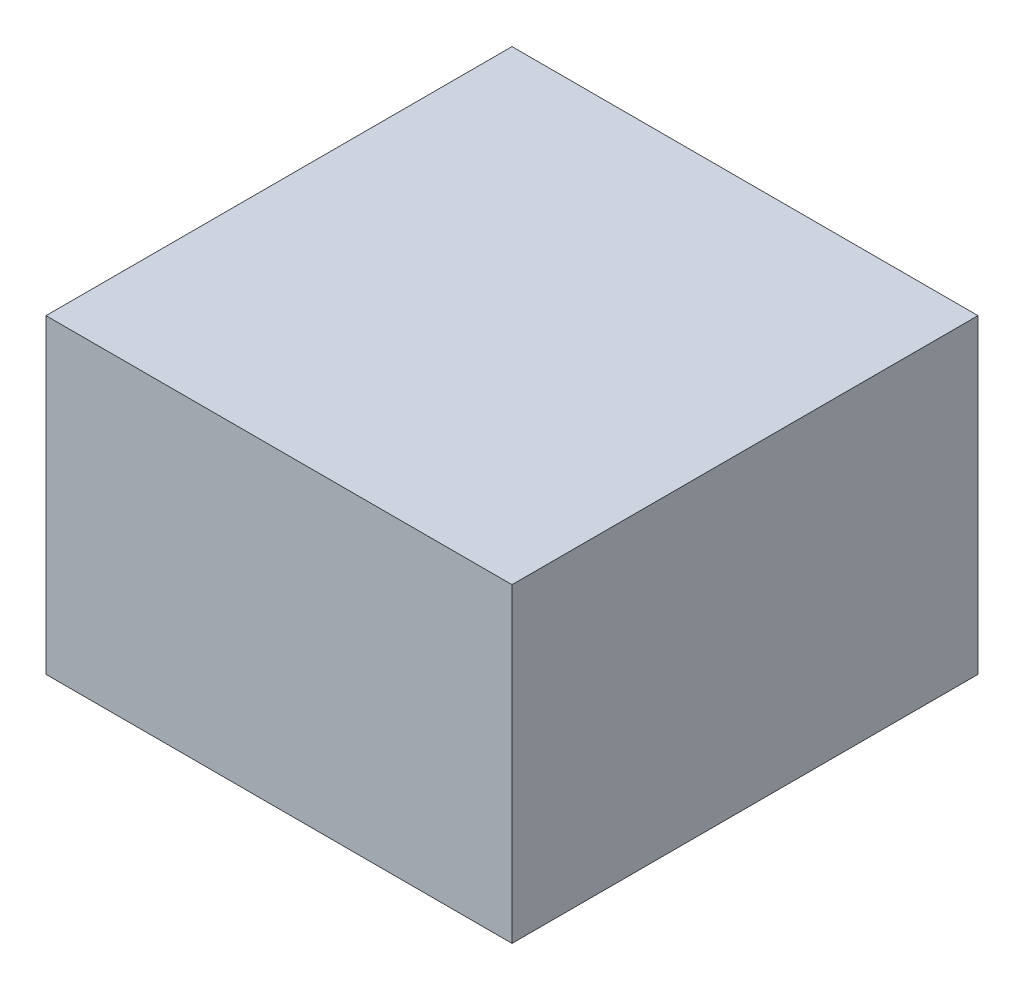
ISO-10303-21;
HEADER;
FILE_DESCRIPTION(('STEP AP214'),'2;1');
FILE_NAME('part.step','',(''),(''),'','','');
FILE_SCHEMA(('AUTOMOTIVE_DESIGN { 1 0 10303 214 1 1 1 1 }'));
ENDSEC;
DATA;
#1=APPLICATION_CONTEXT('core data for automotive mechanical design processes');
#2=APPLICATION_PROTOCOL_DEFINITION('international standard','automotive_design',2000,#1);
#3=PRODUCT_CONTEXT('',#1,'mechanical');
#4=PRODUCT('Part','Part','',(#3));
#5=PRODUCT_RELATED_PRODUCT_CATEGORY('part','',(#4));
#6=PRODUCT_DEFINITION_FORMATION('','',#4);
#7=PRODUCT_DEFINITION_CONTEXT('part definition',#1,'design');
#8=PRODUCT_DEFINITION('design','',#6,#7);
#9=PRODUCT_DEFINITION_SHAPE('','',#8);
#10=(LENGTH_UNIT() NAMED_UNIT(*) SI_UNIT(.MILLI.,.METRE.));
#11=(NAMED_UNIT(*) PLANE_ANGLE_UNIT() SI_UNIT($,.RADIAN.));
#12=(NAMED_UNIT(*) SI_UNIT($,.STERADIAN.) SOLID_ANGLE_UNIT());
#13=UNCERTAINTY_MEASURE_WITH_UNIT(LENGTH_MEASURE(1.E-05),#10,'distance_accuracy_value','');
#14=(GEOMETRIC_REPRESENTATION_CONTEXT(3) GLOBAL_UNCERTAINTY_ASSIGNED_CONTEXT((#13)) GLOBAL_UNIT_ASSIGNED_CONTEXT((#10,
#11,#12)) REPRESENTATION_CONTEXT('',''));
#15=CARTESIAN_POINT('',(0.,0.,0.));
#16=DIRECTION('',(0.,0.,1.));
#17=DIRECTION('',(1.,0.,0.));
#18=AXIS2_PLACEMENT_3D('',#15,#16,#17);
#19=CARTESIAN_POINT('',(30.,-20.,60.));
#20=DIRECTION('',(-1.,0.,0.));
#21=DIRECTION('',(0.,0.,1.));
#22=AXIS2_PLACEMENT_3D('',#19,#20,#21);
#23=PLANE('',#22);
#24=DIRECTION('',(0.,1.,0.));
#25=VECTOR('',#24,1.);
#26=CARTESIAN_POINT('',(30.,-20.,0.));
#27=LINE('',#26,#25);
#28=CARTESIAN_POINT('',(30.,-20.,0.));
#29=VERTEX_POINT('',#28);
#30=CARTESIAN_POINT('',(30.,20.,0.));
#31=VERTEX_POINT('',#30);
#32=EDGE_CURVE('E145',#29,#31,#27,.T.);
#33=ORIENTED_EDGE('',*,*,#32,.T.);
#34=DIRECTION('',(0.,0.,-1.));
#35=VECTOR('',#34,1.);
#36=CARTESIAN_POINT('',(30.,20.,60.));
#37=LINE('',#36,#35);
#38=CARTESIAN_POINT('',(30.,20.,60.));
#39=VERTEX_POINT('',#38);
#40=EDGE_CURVE('E11',#39,#31,#37,.T.);
#41=ORIENTED_EDGE('',*,*,#40,.F.);
#42=DIRECTION('',(0.,1.,0.));
#43=VECTOR('',#42,1.);
#44=CARTESIAN_POINT('',(30.,-20.,60.));
#45=LINE('',#44,#43);
#46=CARTESIAN_POINT('',(30.,-20.,60.));
#47=VERTEX_POINT('',#46);
#48=EDGE_CURVE('E149',#47,#39,#45,.T.);
#49=ORIENTED_EDGE('',*,*,#48,.F.);
#50=DIRECTION('',(0.,0.,-1.));
#51=VECTOR('',#50,1.);
#52=CARTESIAN_POINT('',(30.,-20.,60.));
#53=LINE('',#52,#51);
#54=EDGE_CURVE('E155',#47,#29,#53,.T.);
#55=ORIENTED_EDGE('',*,*,#54,.T.);
#56=EDGE_LOOP('',(#33,#41,#49,#55));
#57=FACE_BOUND('',#56,.T.);
#58=ADVANCED_FACE('F33',(#57),#23,.F.);
#59=CARTESIAN_POINT('',(-30.,20.,60.));
#60=DIRECTION('',(0.,-1.,0.));
#61=DIRECTION('',(0.,0.,-1.));
#62=AXIS2_PLACEMENT_3D('',#59,#60,#61);
#63=PLANE('',#62);
#64=DIRECTION('',(-1.,0.,0.));
#65=VECTOR('',#64,1.);
#66=CARTESIAN_POINT('',(-30.,20.,0.));
#67=LINE('',#66,#65);
#68=CARTESIAN_POINT('',(-30.,20.,0.));
#69=VERTEX_POINT('',#68);
#70=EDGE_CURVE('E158',#31,#69,#67,.T.);
#71=ORIENTED_EDGE('',*,*,#70,.T.);
#72=DIRECTION('',(0.,0.,-1.));
#73=VECTOR('',#72,1.);
#74=CARTESIAN_POINT('',(-30.,20.,60.));
#75=LINE('',#74,#73);
#76=CARTESIAN_POINT('',(-30.,20.,60.));
#77=VERTEX_POINT('',#76);
#78=EDGE_CURVE('E40',#77,#69,#75,.T.);
#79=ORIENTED_EDGE('',*,*,#78,.F.);
#80=DIRECTION('',(-1.,0.,0.));
#81=VECTOR('',#80,1.);
#82=CARTESIAN_POINT('',(-30.,20.,60.));
#83=LINE('',#82,#81);
#84=EDGE_CURVE('E84',#39,#77,#83,.T.);
#85=ORIENTED_EDGE('',*,*,#84,.F.);
#86=ORIENTED_EDGE('',*,*,#40,.T.);
#87=EDGE_LOOP('',(#71,#79,#85,#86));
#88=FACE_BOUND('',#87,.T.);
#89=ADVANCED_FACE('F186',(#88),#63,.F.);
#90=CARTESIAN_POINT('',(-30.,-20.,60.));
#91=DIRECTION('',(1.,0.,0.));
#92=DIRECTION('',(0.,0.,-1.));
#93=AXIS2_PLACEMENT_3D('',#90,#91,#92);
#94=PLANE('',#93);
#95=DIRECTION('',(0.,-1.,0.));
#96=VECTOR('',#95,1.);
#97=CARTESIAN_POINT('',(-30.,-20.,0.));
#98=LINE('',#97,#96);
#99=CARTESIAN_POINT('',(-30.,-20.,0.));
#100=VERTEX_POINT('',#99);
#101=EDGE_CURVE('E160',#69,#100,#98,.T.);
#102=ORIENTED_EDGE('',*,*,#101,.T.);
#103=DIRECTION('',(0.,0.,-1.));
#104=VECTOR('',#103,1.);
#105=CARTESIAN_POINT('',(-30.,-20.,60.));
#106=LINE('',#105,#104);
#107=CARTESIAN_POINT('',(-30.,-20.,60.));
#108=VERTEX_POINT('',#107);
#109=EDGE_CURVE('E164',#108,#100,#106,.T.);
#110=ORIENTED_EDGE('',*,*,#109,.F.);
#111=DIRECTION('',(0.,-1.,0.));
#112=VECTOR('',#111,1.);
#113=CARTESIAN_POINT('',(-30.,-20.,60.));
#114=LINE('',#113,#112);
#115=EDGE_CURVE('E152',#77,#108,#114,.T.);
#116=ORIENTED_EDGE('',*,*,#115,.F.);
#117=ORIENTED_EDGE('',*,*,#78,.T.);
#118=EDGE_LOOP('',(#102,#110,#116,#117));
#119=FACE_BOUND('',#118,.T.);
#120=ADVANCED_FACE('F169',(#119),#94,.F.);
#121=CARTESIAN_POINT('',(-30.,-20.,60.));
#122=DIRECTION('',(0.,1.,0.));
#123=DIRECTION('',(0.,0.,1.));
#124=AXIS2_PLACEMENT_3D('',#121,#122,#123);
#125=PLANE('',#124);
#126=DIRECTION('',(1.,0.,0.));
#127=VECTOR('',#126,1.);
#128=CARTESIAN_POINT('',(-30.,-20.,0.));
#129=LINE('',#128,#127);
#130=EDGE_CURVE('E77',#100,#29,#129,.T.);
#131=ORIENTED_EDGE('',*,*,#130,.T.);
#132=ORIENTED_EDGE('',*,*,#54,.F.);
#133=DIRECTION('',(1.,0.,0.));
#134=VECTOR('',#133,1.);
#135=CARTESIAN_POINT('',(-30.,-20.,60.));
#136=LINE('',#135,#134);
#137=EDGE_CURVE('E56',#108,#47,#136,.T.);
#138=ORIENTED_EDGE('',*,*,#137,.F.);
#139=ORIENTED_EDGE('',*,*,#109,.T.);
#140=EDGE_LOOP('',(#131,#132,#138,#139));
#141=FACE_BOUND('',#140,.T.);
#142=ADVANCED_FACE('F177',(#141),#125,.F.);
#143=CARTESIAN_POINT('',(0.,0.,60.));
#144=DIRECTION('',(0.,0.,-1.));
#145=DIRECTION('',(-1.,0.,0.));
#146=AXIS2_PLACEMENT_3D('',#143,#144,#145);
#147=PLANE('',#146);
#148=ORIENTED_EDGE('',*,*,#48,.T.);
#149=ORIENTED_EDGE('',*,*,#84,.T.);
#150=ORIENTED_EDGE('',*,*,#115,.T.);
#151=ORIENTED_EDGE('',*,*,#137,.T.);
#152=EDGE_LOOP('',(#148,#149,#150,#151));
#153=FACE_BOUND('',#152,.T.);
#154=ADVANCED_FACE('F179',(#153),#147,.F.);
#155=CARTESIAN_POINT('',(0.,0.,0.));
#156=DIRECTION('',(0.,0.,-1.));
#157=DIRECTION('',(-1.,0.,0.));
#158=AXIS2_PLACEMENT_3D('',#155,#156,#157);
#159=PLANE('',#158);
#160=CARTESIAN_POINT('',(26.,17.3333333333333,0.));
#161=DIRECTION('',(0.,0.,-1.));
#162=DIRECTION('',(1.,0.,0.));
#163=AXIS2_PLACEMENT_3D('',#160,#161,#162);
#164=CIRCLE('',#163,2.);
#165=CARTESIAN_POINT('',(28.,17.3333333333333,0.));
#166=VERTEX_POINT('',#165);
#167=EDGE_CURVE('E346',#166,#166,#164,.T.);
#168=ORIENTED_EDGE('',*,*,#167,.F.);
#169=EDGE_LOOP('',(#168));
#170=FACE_BOUND('',#169,.T.);
#171=CARTESIAN_POINT('',(-26.,-17.3333333333333,0.));
#172=DIRECTION('',(0.,0.,-1.));
#173=DIRECTION('',(1.,0.,0.));
#174=AXIS2_PLACEMENT_3D('',#171,#172,#173);
#175=CIRCLE('',#174,2.);
#176=CARTESIAN_POINT('',(-24.,-17.3333333333333,0.));
#177=VERTEX_POINT('',#176);
#178=EDGE_CURVE('E358',#177,#177,#175,.T.);
#179=ORIENTED_EDGE('',*,*,#178,.F.);
#180=EDGE_LOOP('',(#179));
#181=FACE_BOUND('',#180,.T.);
#182=CARTESIAN_POINT('',(26.,-17.3333333333333,0.));
#183=DIRECTION('',(0.,0.,-1.));
#184=DIRECTION('',(-1.,0.,0.));
#185=AXIS2_PLACEMENT_3D('',#182,#183,#184);
#186=CIRCLE('',#185,2.);
#187=CARTESIAN_POINT('',(24.,-17.3333333333333,0.));
#188=VERTEX_POINT('',#187);
#189=EDGE_CURVE('E353',#188,#188,#186,.T.);
#190=ORIENTED_EDGE('',*,*,#189,.F.);
#191=EDGE_LOOP('',(#190));
#192=FACE_BOUND('',#191,.T.);
#193=CARTESIAN_POINT('',(-26.,17.3333333333333,0.));
#194=DIRECTION('',(0.,0.,-1.));
#195=DIRECTION('',(-1.,0.,0.));
#196=AXIS2_PLACEMENT_3D('',#193,#194,#195);
#197=CIRCLE('',#196,2.);
#198=CARTESIAN_POINT('',(-28.,17.3333333333333,0.));
#199=VERTEX_POINT('',#198);
#200=EDGE_CURVE('E132',#199,#199,#197,.T.);
#201=ORIENTED_EDGE('',*,*,#200,.F.);
#202=EDGE_LOOP('',(#201));
#203=FACE_BOUND('',#202,.T.);
#204=DIRECTION('',(0.,1.,0.));
#205=VECTOR('',#204,1.);
#206=CARTESIAN_POINT('',(-20.25,-10.,0.));
#207=LINE('',#206,#205);
#208=CARTESIAN_POINT('',(-20.25,-10.,0.));
#209=VERTEX_POINT('',#208);
#210=CARTESIAN_POINT('',(-20.25,10.,0.));
#211=VERTEX_POINT('',#210);
#212=EDGE_CURVE('E47',#209,#211,#207,.T.);
#213=ORIENTED_EDGE('',*,*,#212,.F.);
#214=DIRECTION('',(-1.,0.,0.));
#215=VECTOR('',#214,1.);
#216=CARTESIAN_POINT('',(20.25,-10.,0.));
#217=LINE('',#216,#215);
#218=CARTESIAN_POINT('',(20.25,-10.,0.));
#219=VERTEX_POINT('',#218);
#220=EDGE_CURVE('E126',#219,#209,#217,.T.);
#221=ORIENTED_EDGE('',*,*,#220,.F.);
#222=DIRECTION('',(0.,-1.,0.));
#223=VECTOR('',#222,1.);
#224=CARTESIAN_POINT('',(20.25,-10.,0.));
#225=LINE('',#224,#223);
#226=CARTESIAN_POINT('',(20.25,10.,0.));
#227=VERTEX_POINT('',#226);
#228=EDGE_CURVE('E129',#227,#219,#225,.T.);
#229=ORIENTED_EDGE('',*,*,#228,.F.);
#230=DIRECTION('',(1.,0.,0.));
#231=VECTOR('',#230,1.);
#232=CARTESIAN_POINT('',(20.25,10.,0.));
#233=LINE('',#232,#231);
#234=EDGE_CURVE('E138',#211,#227,#233,.T.);
#235=ORIENTED_EDGE('',*,*,#234,.F.);
#236=EDGE_LOOP('',(#213,#221,#229,#235));
#237=FACE_BOUND('',#236,.T.);
#238=ORIENTED_EDGE('',*,*,#32,.F.);
#239=ORIENTED_EDGE('',*,*,#130,.F.);
#240=ORIENTED_EDGE('',*,*,#101,.F.);
#241=ORIENTED_EDGE('',*,*,#70,.F.);
#242=EDGE_LOOP('',(#238,#239,#240,#241));
#243=FACE_BOUND('',#242,.T.);
#244=ADVANCED_FACE('F173',(#170,#181,#192,#203,#237,#243),#159,.T.);
#245=CARTESIAN_POINT('',(-20.25,-10.,39.));
#246=DIRECTION('',(-1.,0.,0.));
#247=DIRECTION('',(0.,0.,1.));
#248=AXIS2_PLACEMENT_3D('',#245,#246,#247);
#249=PLANE('',#248);
#250=ORIENTED_EDGE('',*,*,#212,.T.);
#251=DIRECTION('',(0.,0.,-1.));
#252=VECTOR('',#251,1.);
#253=CARTESIAN_POINT('',(-20.25,10.,39.));
#254=LINE('',#253,#252);
#255=CARTESIAN_POINT('',(-20.25,10.,39.));
#256=VERTEX_POINT('',#255);
#257=EDGE_CURVE('E104',#256,#211,#254,.T.);
#258=ORIENTED_EDGE('',*,*,#257,.F.);
#259=DIRECTION('',(0.,1.,0.));
#260=VECTOR('',#259,1.);
#261=CARTESIAN_POINT('',(-20.25,-10.,39.));
#262=LINE('',#261,#260);
#263=CARTESIAN_POINT('',(-20.25,-10.,39.));
#264=VERTEX_POINT('',#263);
#265=EDGE_CURVE('E108',#264,#256,#262,.T.);
#266=ORIENTED_EDGE('',*,*,#265,.F.);
#267=DIRECTION('',(0.,0.,-1.));
#268=VECTOR('',#267,1.);
#269=CARTESIAN_POINT('',(-20.25,-10.,39.));
#270=LINE('',#269,#268);
#271=EDGE_CURVE('E143',#264,#209,#270,.T.);
#272=ORIENTED_EDGE('',*,*,#271,.T.);
#273=EDGE_LOOP('',(#250,#258,#266,#272));
#274=FACE_BOUND('',#273,.T.);
#275=ADVANCED_FACE('F106',(#274),#249,.F.);
#276=CARTESIAN_POINT('',(20.25,-10.,39.));
#277=DIRECTION('',(0.,-1.,0.));
#278=DIRECTION('',(0.,0.,-1.));
#279=AXIS2_PLACEMENT_3D('',#276,#277,#278);
#280=PLANE('',#279);
#281=ORIENTED_EDGE('',*,*,#220,.T.);
#282=ORIENTED_EDGE('',*,*,#271,.F.);
#283=DIRECTION('',(-1.,0.,0.));
#284=VECTOR('',#283,1.);
#285=CARTESIAN_POINT('',(20.25,-10.,39.));
#286=LINE('',#285,#284);
#287=CARTESIAN_POINT('',(20.25,-10.,39.));
#288=VERTEX_POINT('',#287);
#289=EDGE_CURVE('E114',#288,#264,#286,.T.);
#290=ORIENTED_EDGE('',*,*,#289,.F.);
#291=DIRECTION('',(0.,0.,-1.));
#292=VECTOR('',#291,1.);
#293=CARTESIAN_POINT('',(20.25,-10.,39.));
#294=LINE('',#293,#292);
#295=EDGE_CURVE('E146',#288,#219,#294,.T.);
#296=ORIENTED_EDGE('',*,*,#295,.T.);
#297=EDGE_LOOP('',(#281,#282,#290,#296));
#298=FACE_BOUND('',#297,.T.);
#299=ADVANCED_FACE('F220',(#298),#280,.F.);
#300=CARTESIAN_POINT('',(20.25,-10.,39.));
#301=DIRECTION('',(1.,0.,0.));
#302=DIRECTION('',(0.,0.,-1.));
#303=AXIS2_PLACEMENT_3D('',#300,#301,#302);
#304=PLANE('',#303);
#305=ORIENTED_EDGE('',*,*,#228,.T.);
#306=ORIENTED_EDGE('',*,*,#295,.F.);
#307=DIRECTION('',(0.,-1.,0.));
#308=VECTOR('',#307,1.);
#309=CARTESIAN_POINT('',(20.25,-10.,39.));
#310=LINE('',#309,#308);
#311=CARTESIAN_POINT('',(20.25,10.,39.));
#312=VERTEX_POINT('',#311);
#313=EDGE_CURVE('E122',#312,#288,#310,.T.);
#314=ORIENTED_EDGE('',*,*,#313,.F.);
#315=DIRECTION('',(0.,0.,-1.));
#316=VECTOR('',#315,1.);
#317=CARTESIAN_POINT('',(20.25,10.,39.));
#318=LINE('',#317,#316);
#319=EDGE_CURVE('E113',#312,#227,#318,.T.);
#320=ORIENTED_EDGE('',*,*,#319,.T.);
#321=EDGE_LOOP('',(#305,#306,#314,#320));
#322=FACE_BOUND('',#321,.T.);
#323=ADVANCED_FACE('F229',(#322),#304,.F.);
#324=CARTESIAN_POINT('',(20.25,10.,39.));
#325=DIRECTION('',(0.,1.,0.));
#326=DIRECTION('',(0.,0.,1.));
#327=AXIS2_PLACEMENT_3D('',#324,#325,#326);
#328=PLANE('',#327);
#329=ORIENTED_EDGE('',*,*,#234,.T.);
#330=ORIENTED_EDGE('',*,*,#319,.F.);
#331=DIRECTION('',(1.,0.,0.));
#332=VECTOR('',#331,1.);
#333=CARTESIAN_POINT('',(20.25,10.,39.));
#334=LINE('',#333,#332);
#335=EDGE_CURVE('E117',#256,#312,#334,.T.);
#336=ORIENTED_EDGE('',*,*,#335,.F.);
#337=ORIENTED_EDGE('',*,*,#257,.T.);
#338=EDGE_LOOP('',(#329,#330,#336,#337));
#339=FACE_BOUND('',#338,.T.);
#340=ADVANCED_FACE('F118',(#339),#328,.F.);
#341=CARTESIAN_POINT('',(0.,0.,39.));
#342=DIRECTION('',(0.,0.,1.));
#343=DIRECTION('',(1.,0.,0.));
#344=AXIS2_PLACEMENT_3D('',#341,#342,#343);
#345=PLANE('',#344);
#346=ORIENTED_EDGE('',*,*,#265,.T.);
#347=ORIENTED_EDGE('',*,*,#335,.T.);
#348=ORIENTED_EDGE('',*,*,#313,.T.);
#349=ORIENTED_EDGE('',*,*,#289,.T.);
#350=EDGE_LOOP('',(#346,#347,#348,#349));
#351=FACE_BOUND('',#350,.T.);
#352=ADVANCED_FACE('F124',(#351),#345,.F.);
#353=CARTESIAN_POINT('',(-26.,17.3333333333333,5.));
#354=DIRECTION('',(0.,0.,-1.));
#355=DIRECTION('',(-1.,0.,0.));
#356=AXIS2_PLACEMENT_3D('',#353,#354,#355);
#357=CYLINDRICAL_SURFACE('',#356,2.);
#358=CARTESIAN_POINT('',(-26.,17.3333333333333,5.));
#359=DIRECTION('',(0.,0.,-1.));
#360=DIRECTION('',(-1.,0.,0.));
#361=AXIS2_PLACEMENT_3D('',#358,#359,#360);
#362=CIRCLE('',#361,2.);
#363=CARTESIAN_POINT('',(-28.,17.3333333333333,5.));
#364=VERTEX_POINT('',#363);
#365=EDGE_CURVE('E139',#364,#364,#362,.T.);
#366=ORIENTED_EDGE('',*,*,#365,.F.);
#367=EDGE_LOOP('',(#366));
#368=FACE_BOUND('',#367,.T.);
#369=ORIENTED_EDGE('',*,*,#200,.T.);
#370=EDGE_LOOP('',(#369));
#371=FACE_BOUND('',#370,.T.);
#372=ADVANCED_FACE('F256',(#368,#371),#357,.F.);
#373=CARTESIAN_POINT('',(-26.,17.3333333333333,5.));
#374=DIRECTION('',(0.,0.,-1.));
#375=DIRECTION('',(-1.,0.,0.));
#376=AXIS2_PLACEMENT_3D('',#373,#374,#375);
#377=PLANE('',#376);
#378=ORIENTED_EDGE('',*,*,#365,.T.);
#379=EDGE_LOOP('',(#378));
#380=FACE_BOUND('',#379,.T.);
#381=ADVANCED_FACE('F269',(#380),#377,.T.);
#382=CARTESIAN_POINT('',(26.,-17.3333333333333,5.));
#383=DIRECTION('',(0.,0.,-1.));
#384=DIRECTION('',(-1.,0.,0.));
#385=AXIS2_PLACEMENT_3D('',#382,#383,#384);
#386=CYLINDRICAL_SURFACE('',#385,2.);
#387=CARTESIAN_POINT('',(26.,-17.3333333333333,5.));
#388=DIRECTION('',(0.,0.,-1.));
#389=DIRECTION('',(-1.,0.,0.));
#390=AXIS2_PLACEMENT_3D('',#387,#388,#389);
#391=CIRCLE('',#390,2.);
#392=CARTESIAN_POINT('',(24.,-17.3333333333333,5.));
#393=VERTEX_POINT('',#392);
#394=EDGE_CURVE('E360',#393,#393,#391,.T.);
#395=ORIENTED_EDGE('',*,*,#394,.F.);
#396=EDGE_LOOP('',(#395));
#397=FACE_BOUND('',#396,.T.);
#398=ORIENTED_EDGE('',*,*,#189,.T.);
#399=EDGE_LOOP('',(#398));
#400=FACE_BOUND('',#399,.T.);
#401=ADVANCED_FACE('F279',(#397,#400),#386,.F.);
#402=CARTESIAN_POINT('',(26.,-17.3333333333333,5.));
#403=DIRECTION('',(0.,0.,-1.));
#404=DIRECTION('',(-1.,0.,0.));
#405=AXIS2_PLACEMENT_3D('',#402,#403,#404);
#406=PLANE('',#405);
#407=ORIENTED_EDGE('',*,*,#394,.T.);
#408=EDGE_LOOP('',(#407));
#409=FACE_BOUND('',#408,.T.);
#410=ADVANCED_FACE('F289',(#409),#406,.T.);
#411=CARTESIAN_POINT('',(-26.,-17.3333333333333,5.));
#412=DIRECTION('',(0.,0.,-1.));
#413=DIRECTION('',(-1.,0.,0.));
#414=AXIS2_PLACEMENT_3D('',#411,#412,#413);
#415=CYLINDRICAL_SURFACE('',#414,2.);
#416=CARTESIAN_POINT('',(-26.,-17.3333333333333,5.));
#417=DIRECTION('',(0.,0.,-1.));
#418=DIRECTION('',(1.,0.,0.));
#419=AXIS2_PLACEMENT_3D('',#416,#417,#418);
#420=CIRCLE('',#419,2.);
#421=CARTESIAN_POINT('',(-24.,-17.3333333333333,5.));
#422=VERTEX_POINT('',#421);
#423=EDGE_CURVE('E350',#422,#422,#420,.T.);
#424=ORIENTED_EDGE('',*,*,#423,.F.);
#425=EDGE_LOOP('',(#424));
#426=FACE_BOUND('',#425,.T.);
#427=ORIENTED_EDGE('',*,*,#178,.T.);
#428=EDGE_LOOP('',(#427));
#429=FACE_BOUND('',#428,.T.);
#430=ADVANCED_FACE('F299',(#426,#429),#415,.F.);
#431=CARTESIAN_POINT('',(-26.,-17.3333333333333,5.));
#432=DIRECTION('',(0.,0.,1.));
#433=DIRECTION('',(1.,0.,0.));
#434=AXIS2_PLACEMENT_3D('',#431,#432,#433);
#435=PLANE('',#434);
#436=ORIENTED_EDGE('',*,*,#423,.T.);
#437=EDGE_LOOP('',(#436));
#438=FACE_BOUND('',#437,.T.);
#439=ADVANCED_FACE('F309',(#438),#435,.F.);
#440=CARTESIAN_POINT('',(26.,17.3333333333333,5.));
#441=DIRECTION('',(0.,0.,-1.));
#442=DIRECTION('',(-1.,0.,0.));
#443=AXIS2_PLACEMENT_3D('',#440,#441,#442);
#444=CYLINDRICAL_SURFACE('',#443,2.);
#445=CARTESIAN_POINT('',(26.,17.3333333333333,5.));
#446=DIRECTION('',(0.,0.,-1.));
#447=DIRECTION('',(1.,0.,0.));
#448=AXIS2_PLACEMENT_3D('',#445,#446,#447);
#449=CIRCLE('',#448,2.);
#450=CARTESIAN_POINT('',(28.,17.3333333333333,5.));
#451=VERTEX_POINT('',#450);
#452=EDGE_CURVE('E345',#451,#451,#449,.T.);
#453=ORIENTED_EDGE('',*,*,#452,.F.);
#454=EDGE_LOOP('',(#453));
#455=FACE_BOUND('',#454,.T.);
#456=ORIENTED_EDGE('',*,*,#167,.T.);
#457=EDGE_LOOP('',(#456));
#458=FACE_BOUND('',#457,.T.);
#459=ADVANCED_FACE('F319',(#455,#458),#444,.F.);
#460=CARTESIAN_POINT('',(26.,17.3333333333333,5.));
#461=DIRECTION('',(0.,0.,1.));
#462=DIRECTION('',(1.,0.,0.));
#463=AXIS2_PLACEMENT_3D('',#460,#461,#462);
#464=PLANE('',#463);
#465=ORIENTED_EDGE('',*,*,#452,.T.);
#466=EDGE_LOOP('',(#465));
#467=FACE_BOUND('',#466,.T.);
#468=ADVANCED_FACE('F329',(#467),#464,.F.);
#469=CLOSED_SHELL('',(#58,#89,#120,#142,#154,#244,#275,#299,#323,#340,#352,#372,#381,#401,#410,
#430,#439,#459,#468));
#470=MANIFOLD_SOLID_BREP('B2',#469);
#471=ADVANCED_BREP_SHAPE_REPRESENTATION('',(#18,#470),#14);
#472=SHAPE_DEFINITION_REPRESENTATION(#9,#471);
ENDSEC;
END-ISO-10303-21;
